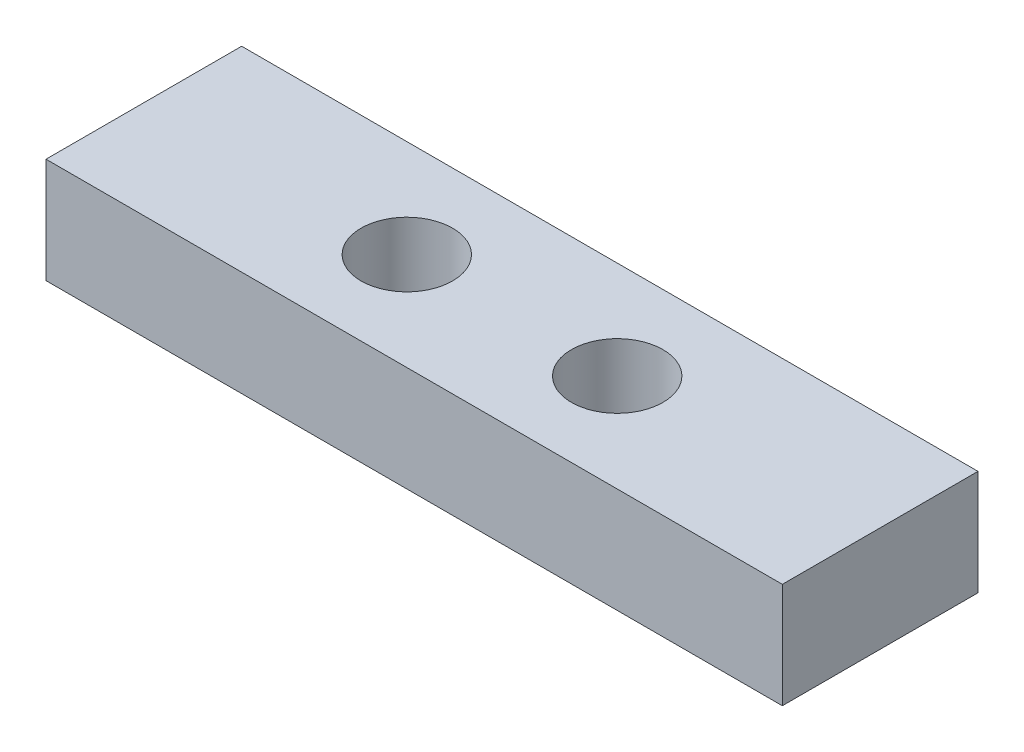
ISO-10303-21;
HEADER;
FILE_DESCRIPTION(('STEP AP214'),'2;1');
FILE_NAME('part.step','',(''),(''),'','','');
FILE_SCHEMA(('AUTOMOTIVE_DESIGN { 1 0 10303 214 1 1 1 1 }'));
ENDSEC;
DATA;
#1=APPLICATION_CONTEXT('core data for automotive mechanical design processes');
#2=APPLICATION_PROTOCOL_DEFINITION('international standard','automotive_design',2000,#1);
#3=PRODUCT_CONTEXT('',#1,'mechanical');
#4=PRODUCT('Part','Part','',(#3));
#5=PRODUCT_RELATED_PRODUCT_CATEGORY('part','',(#4));
#6=PRODUCT_DEFINITION_FORMATION('','',#4);
#7=PRODUCT_DEFINITION_CONTEXT('part definition',#1,'design');
#8=PRODUCT_DEFINITION('design','',#6,#7);
#9=PRODUCT_DEFINITION_SHAPE('','',#8);
#10=(LENGTH_UNIT() NAMED_UNIT(*) SI_UNIT(.MILLI.,.METRE.));
#11=(NAMED_UNIT(*) PLANE_ANGLE_UNIT() SI_UNIT($,.RADIAN.));
#12=(NAMED_UNIT(*) SI_UNIT($,.STERADIAN.) SOLID_ANGLE_UNIT());
#13=UNCERTAINTY_MEASURE_WITH_UNIT(LENGTH_MEASURE(1.E-05),#10,'distance_accuracy_value','');
#14=(GEOMETRIC_REPRESENTATION_CONTEXT(3) GLOBAL_UNCERTAINTY_ASSIGNED_CONTEXT((#13)) GLOBAL_UNIT_ASSIGNED_CONTEXT((#10,
#11,#12)) REPRESENTATION_CONTEXT('',''));
#15=CARTESIAN_POINT('',(0.,0.,0.));
#16=DIRECTION('',(0.,0.,1.));
#17=DIRECTION('',(1.,0.,0.));
#18=AXIS2_PLACEMENT_3D('',#15,#16,#17);
#19=CARTESIAN_POINT('',(0.,5.,0.));
#20=DIRECTION('',(0.,-1.,0.));
#21=DIRECTION('',(0.,0.,-1.));
#22=AXIS2_PLACEMENT_3D('',#19,#20,#21);
#23=PLANE('',#22);
#24=DIRECTION('',(0.,0.,-1.));
#25=VECTOR('',#24,1.);
#26=CARTESIAN_POINT('',(17.5,5.,4.65));
#27=LINE('',#26,#25);
#28=CARTESIAN_POINT('',(17.5,5.,4.65));
#29=VERTEX_POINT('',#28);
#30=CARTESIAN_POINT('',(17.5,5.,-4.65));
#31=VERTEX_POINT('',#30);
#32=EDGE_CURVE('E98',#29,#31,#27,.T.);
#33=ORIENTED_EDGE('',*,*,#32,.T.);
#34=DIRECTION('',(-1.,0.,0.));
#35=VECTOR('',#34,1.);
#36=CARTESIAN_POINT('',(-17.5,5.,-4.65));
#37=LINE('',#36,#35);
#38=CARTESIAN_POINT('',(-17.5,5.,-4.65));
#39=VERTEX_POINT('',#38);
#40=EDGE_CURVE('E93',#31,#39,#37,.T.);
#41=ORIENTED_EDGE('',*,*,#40,.T.);
#42=DIRECTION('',(0.,0.,1.));
#43=VECTOR('',#42,1.);
#44=CARTESIAN_POINT('',(-17.5,5.,4.65));
#45=LINE('',#44,#43);
#46=CARTESIAN_POINT('',(-17.5,5.,4.65));
#47=VERTEX_POINT('',#46);
#48=EDGE_CURVE('E96',#39,#47,#45,.T.);
#49=ORIENTED_EDGE('',*,*,#48,.T.);
#50=DIRECTION('',(1.,0.,0.));
#51=VECTOR('',#50,1.);
#52=CARTESIAN_POINT('',(-17.5,5.,4.65));
#53=LINE('',#52,#51);
#54=EDGE_CURVE('E63',#47,#29,#53,.T.);
#55=ORIENTED_EDGE('',*,*,#54,.T.);
#56=EDGE_LOOP('',(#33,#41,#49,#55));
#57=FACE_BOUND('',#56,.T.);
#58=CARTESIAN_POINT('',(-5.,5.,0.));
#59=DIRECTION('',(0.,1.,0.));
#60=DIRECTION('',(0.,0.,1.));
#61=AXIS2_PLACEMENT_3D('',#58,#59,#60);
#62=CIRCLE('',#61,2.175);
#63=CARTESIAN_POINT('',(-5.,5.,2.175));
#64=VERTEX_POINT('',#63);
#65=EDGE_CURVE('E118',#64,#64,#62,.T.);
#66=ORIENTED_EDGE('',*,*,#65,.F.);
#67=EDGE_LOOP('',(#66));
#68=FACE_BOUND('',#67,.T.);
#69=CARTESIAN_POINT('',(5.,5.,0.));
#70=DIRECTION('',(0.,1.,0.));
#71=DIRECTION('',(0.,0.,-1.));
#72=AXIS2_PLACEMENT_3D('',#69,#70,#71);
#73=CIRCLE('',#72,2.175);
#74=CARTESIAN_POINT('',(5.,5.,-2.175));
#75=VERTEX_POINT('',#74);
#76=EDGE_CURVE('E140',#75,#75,#73,.T.);
#77=ORIENTED_EDGE('',*,*,#76,.F.);
#78=EDGE_LOOP('',(#77));
#79=FACE_BOUND('',#78,.T.);
#80=ADVANCED_FACE('F45',(#57,#68,#79),#23,.F.);
#81=CARTESIAN_POINT('',(0.,0.,0.));
#82=DIRECTION('',(0.,-1.,0.));
#83=DIRECTION('',(0.,0.,-1.));
#84=AXIS2_PLACEMENT_3D('',#81,#82,#83);
#85=PLANE('',#84);
#86=CARTESIAN_POINT('',(-5.,0.,0.));
#87=DIRECTION('',(0.,1.,0.));
#88=DIRECTION('',(0.,0.,1.));
#89=AXIS2_PLACEMENT_3D('',#86,#87,#88);
#90=CIRCLE('',#89,2.175);
#91=CARTESIAN_POINT('',(-5.,0.,2.175));
#92=VERTEX_POINT('',#91);
#93=EDGE_CURVE('E136',#92,#92,#90,.T.);
#94=ORIENTED_EDGE('',*,*,#93,.T.);
#95=EDGE_LOOP('',(#94));
#96=FACE_BOUND('',#95,.T.);
#97=DIRECTION('',(0.,0.,-1.));
#98=VECTOR('',#97,1.);
#99=CARTESIAN_POINT('',(17.5,0.,4.65));
#100=LINE('',#99,#98);
#101=CARTESIAN_POINT('',(17.5,0.,4.65));
#102=VERTEX_POINT('',#101);
#103=CARTESIAN_POINT('',(17.5,0.,-4.65));
#104=VERTEX_POINT('',#103);
#105=EDGE_CURVE('E114',#102,#104,#100,.T.);
#106=ORIENTED_EDGE('',*,*,#105,.F.);
#107=DIRECTION('',(1.,0.,0.));
#108=VECTOR('',#107,1.);
#109=CARTESIAN_POINT('',(-17.5,0.,4.65));
#110=LINE('',#109,#108);
#111=CARTESIAN_POINT('',(-17.5,0.,4.65));
#112=VERTEX_POINT('',#111);
#113=EDGE_CURVE('E86',#112,#102,#110,.T.);
#114=ORIENTED_EDGE('',*,*,#113,.F.);
#115=DIRECTION('',(0.,0.,1.));
#116=VECTOR('',#115,1.);
#117=CARTESIAN_POINT('',(-17.5,0.,4.65));
#118=LINE('',#117,#116);
#119=CARTESIAN_POINT('',(-17.5,0.,-4.65));
#120=VERTEX_POINT('',#119);
#121=EDGE_CURVE('E80',#120,#112,#118,.T.);
#122=ORIENTED_EDGE('',*,*,#121,.F.);
#123=DIRECTION('',(-1.,0.,0.));
#124=VECTOR('',#123,1.);
#125=CARTESIAN_POINT('',(-17.5,0.,-4.65));
#126=LINE('',#125,#124);
#127=EDGE_CURVE('E103',#104,#120,#126,.T.);
#128=ORIENTED_EDGE('',*,*,#127,.F.);
#129=EDGE_LOOP('',(#106,#114,#122,#128));
#130=FACE_BOUND('',#129,.T.);
#131=CARTESIAN_POINT('',(5.,0.,0.));
#132=DIRECTION('',(0.,1.,0.));
#133=DIRECTION('',(0.,0.,-1.));
#134=AXIS2_PLACEMENT_3D('',#131,#132,#133);
#135=CIRCLE('',#134,2.175);
#136=CARTESIAN_POINT('',(5.,0.,-2.175));
#137=VERTEX_POINT('',#136);
#138=EDGE_CURVE('E144',#137,#137,#135,.T.);
#139=ORIENTED_EDGE('',*,*,#138,.T.);
#140=EDGE_LOOP('',(#139));
#141=FACE_BOUND('',#140,.T.);
#142=ADVANCED_FACE('F131',(#96,#130,#141),#85,.T.);
#143=CARTESIAN_POINT('',(17.5,5.,4.65));
#144=DIRECTION('',(-1.,0.,0.));
#145=DIRECTION('',(0.,0.,1.));
#146=AXIS2_PLACEMENT_3D('',#143,#144,#145);
#147=PLANE('',#146);
#148=ORIENTED_EDGE('',*,*,#105,.T.);
#149=DIRECTION('',(0.,-1.,0.));
#150=VECTOR('',#149,1.);
#151=CARTESIAN_POINT('',(17.5,5.,-4.65));
#152=LINE('',#151,#150);
#153=EDGE_CURVE('E11',#31,#104,#152,.T.);
#154=ORIENTED_EDGE('',*,*,#153,.F.);
#155=ORIENTED_EDGE('',*,*,#32,.F.);
#156=DIRECTION('',(0.,-1.,0.));
#157=VECTOR('',#156,1.);
#158=CARTESIAN_POINT('',(17.5,5.,4.65));
#159=LINE('',#158,#157);
#160=EDGE_CURVE('E110',#29,#102,#159,.T.);
#161=ORIENTED_EDGE('',*,*,#160,.T.);
#162=EDGE_LOOP('',(#148,#154,#155,#161));
#163=FACE_BOUND('',#162,.T.);
#164=ADVANCED_FACE('F47',(#163),#147,.F.);
#165=CARTESIAN_POINT('',(-17.5,5.,-4.65));
#166=DIRECTION('',(0.,0.,1.));
#167=DIRECTION('',(1.,0.,0.));
#168=AXIS2_PLACEMENT_3D('',#165,#166,#167);
#169=PLANE('',#168);
#170=ORIENTED_EDGE('',*,*,#127,.T.);
#171=DIRECTION('',(0.,-1.,0.));
#172=VECTOR('',#171,1.);
#173=CARTESIAN_POINT('',(-17.5,5.,-4.65));
#174=LINE('',#173,#172);
#175=EDGE_CURVE('E55',#39,#120,#174,.T.);
#176=ORIENTED_EDGE('',*,*,#175,.F.);
#177=ORIENTED_EDGE('',*,*,#40,.F.);
#178=ORIENTED_EDGE('',*,*,#153,.T.);
#179=EDGE_LOOP('',(#170,#176,#177,#178));
#180=FACE_BOUND('',#179,.T.);
#181=ADVANCED_FACE('F102',(#180),#169,.F.);
#182=CARTESIAN_POINT('',(-17.5,5.,4.65));
#183=DIRECTION('',(1.,0.,0.));
#184=DIRECTION('',(0.,0.,-1.));
#185=AXIS2_PLACEMENT_3D('',#182,#183,#184);
#186=PLANE('',#185);
#187=ORIENTED_EDGE('',*,*,#121,.T.);
#188=DIRECTION('',(0.,-1.,0.));
#189=VECTOR('',#188,1.);
#190=CARTESIAN_POINT('',(-17.5,5.,4.65));
#191=LINE('',#190,#189);
#192=EDGE_CURVE('E105',#47,#112,#191,.T.);
#193=ORIENTED_EDGE('',*,*,#192,.F.);
#194=ORIENTED_EDGE('',*,*,#48,.F.);
#195=ORIENTED_EDGE('',*,*,#175,.T.);
#196=EDGE_LOOP('',(#187,#193,#194,#195));
#197=FACE_BOUND('',#196,.T.);
#198=ADVANCED_FACE('F106',(#197),#186,.F.);
#199=CARTESIAN_POINT('',(-17.5,5.,4.65));
#200=DIRECTION('',(0.,0.,-1.));
#201=DIRECTION('',(-1.,0.,0.));
#202=AXIS2_PLACEMENT_3D('',#199,#200,#201);
#203=PLANE('',#202);
#204=ORIENTED_EDGE('',*,*,#113,.T.);
#205=ORIENTED_EDGE('',*,*,#160,.F.);
#206=ORIENTED_EDGE('',*,*,#54,.F.);
#207=ORIENTED_EDGE('',*,*,#192,.T.);
#208=EDGE_LOOP('',(#204,#205,#206,#207));
#209=FACE_BOUND('',#208,.T.);
#210=ADVANCED_FACE('F128',(#209),#203,.F.);
#211=CARTESIAN_POINT('',(-5.,5.,0.));
#212=DIRECTION('',(0.,-1.,0.));
#213=DIRECTION('',(0.,0.,-1.));
#214=AXIS2_PLACEMENT_3D('',#211,#212,#213);
#215=CYLINDRICAL_SURFACE('',#214,2.175);
#216=ORIENTED_EDGE('',*,*,#65,.T.);
#217=EDGE_LOOP('',(#216));
#218=FACE_BOUND('',#217,.T.);
#219=ORIENTED_EDGE('',*,*,#93,.F.);
#220=EDGE_LOOP('',(#219));
#221=FACE_BOUND('',#220,.T.);
#222=ADVANCED_FACE('F163',(#218,#221),#215,.F.);
#223=CARTESIAN_POINT('',(5.,5.,0.));
#224=DIRECTION('',(0.,-1.,0.));
#225=DIRECTION('',(0.,0.,-1.));
#226=AXIS2_PLACEMENT_3D('',#223,#224,#225);
#227=CYLINDRICAL_SURFACE('',#226,2.175);
#228=ORIENTED_EDGE('',*,*,#76,.T.);
#229=EDGE_LOOP('',(#228));
#230=FACE_BOUND('',#229,.T.);
#231=ORIENTED_EDGE('',*,*,#138,.F.);
#232=EDGE_LOOP('',(#231));
#233=FACE_BOUND('',#232,.T.);
#234=ADVANCED_FACE('F152',(#230,#233),#227,.F.);
#235=CLOSED_SHELL('',(#80,#142,#164,#181,#198,#210,#222,#234));
#236=MANIFOLD_SOLID_BREP('B2',#235);
#237=ADVANCED_BREP_SHAPE_REPRESENTATION('',(#18,#236),#14);
#238=SHAPE_DEFINITION_REPRESENTATION(#9,#237);
ENDSEC;
END-ISO-10303-21;
